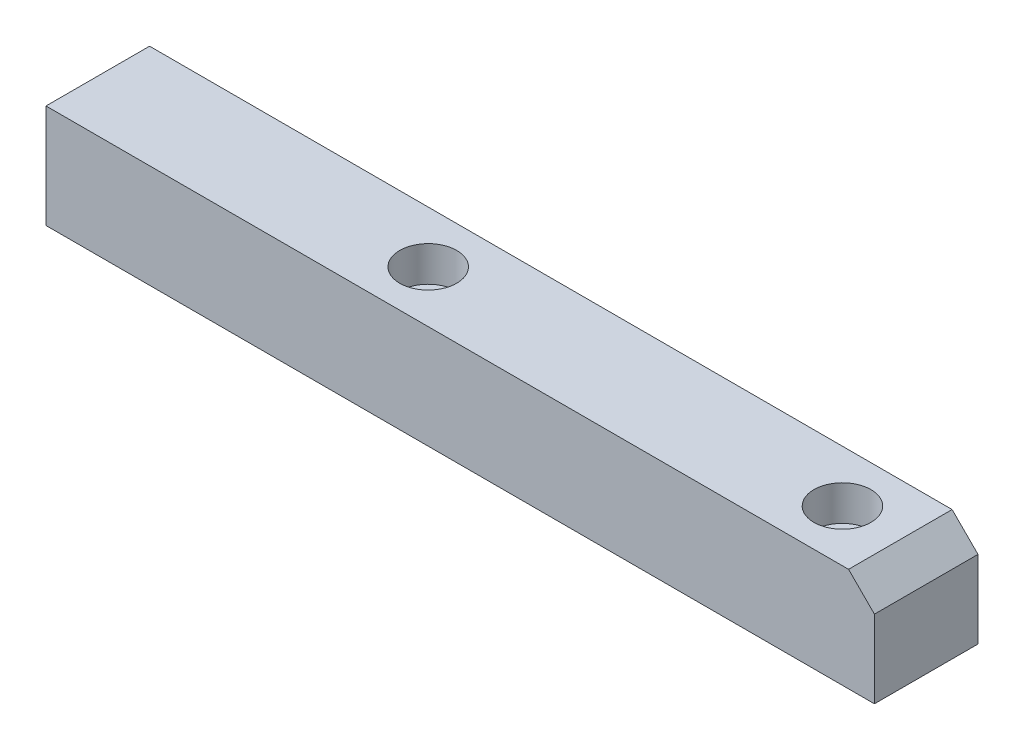
ISO-10303-21;
HEADER;
FILE_DESCRIPTION(('STEP AP214'),'2;1');
FILE_NAME('part.step','',(''),(''),'','','');
FILE_SCHEMA(('AUTOMOTIVE_DESIGN { 1 0 10303 214 1 1 1 1 }'));
ENDSEC;
DATA;
#1=APPLICATION_CONTEXT('core data for automotive mechanical design processes');
#2=APPLICATION_PROTOCOL_DEFINITION('international standard','automotive_design',2000,#1);
#3=PRODUCT_CONTEXT('',#1,'mechanical');
#4=PRODUCT('Part','Part','',(#3));
#5=PRODUCT_RELATED_PRODUCT_CATEGORY('part','',(#4));
#6=PRODUCT_DEFINITION_FORMATION('','',#4);
#7=PRODUCT_DEFINITION_CONTEXT('part definition',#1,'design');
#8=PRODUCT_DEFINITION('design','',#6,#7);
#9=PRODUCT_DEFINITION_SHAPE('','',#8);
#10=(LENGTH_UNIT() NAMED_UNIT(*) SI_UNIT(.MILLI.,.METRE.));
#11=(NAMED_UNIT(*) PLANE_ANGLE_UNIT() SI_UNIT($,.RADIAN.));
#12=(NAMED_UNIT(*) SI_UNIT($,.STERADIAN.) SOLID_ANGLE_UNIT());
#13=UNCERTAINTY_MEASURE_WITH_UNIT(LENGTH_MEASURE(1.E-05),#10,'distance_accuracy_value','');
#14=(GEOMETRIC_REPRESENTATION_CONTEXT(3) GLOBAL_UNCERTAINTY_ASSIGNED_CONTEXT((#13)) GLOBAL_UNIT_ASSIGNED_CONTEXT((#10,
#11,#12)) REPRESENTATION_CONTEXT('',''));
#15=CARTESIAN_POINT('',(0.,0.,0.));
#16=DIRECTION('',(0.,0.,1.));
#17=DIRECTION('',(1.,0.,0.));
#18=AXIS2_PLACEMENT_3D('',#15,#16,#17);
#19=CARTESIAN_POINT('',(-80.,10.,10.));
#20=DIRECTION('',(1.,0.,0.));
#21=DIRECTION('',(0.,0.,-1.));
#22=AXIS2_PLACEMENT_3D('',#19,#20,#21);
#23=PLANE('',#22);
#24=CARTESIAN_POINT('',(-80.,0.,0.));
#25=DIRECTION('',(-1.,0.,0.));
#26=DIRECTION('',(0.,0.,1.));
#27=AXIS2_PLACEMENT_3D('',#24,#25,#26);
#28=CIRCLE('',#27,2.5);
#29=CARTESIAN_POINT('',(-80.,0.,2.5));
#30=VERTEX_POINT('',#29);
#31=EDGE_CURVE('E105',#30,#30,#28,.T.);
#32=ORIENTED_EDGE('',*,*,#31,.F.);
#33=EDGE_LOOP('',(#32));
#34=FACE_BOUND('',#33,.T.);
#35=DIRECTION('',(0.,0.,1.));
#36=VECTOR('',#35,1.);
#37=CARTESIAN_POINT('',(-80.,-10.,10.));
#38=LINE('',#37,#36);
#39=CARTESIAN_POINT('',(-80.,-10.,-9.99999999999999));
#40=VERTEX_POINT('',#39);
#41=CARTESIAN_POINT('',(-80.,-10.,10.));
#42=VERTEX_POINT('',#41);
#43=EDGE_CURVE('E142',#40,#42,#38,.T.);
#44=ORIENTED_EDGE('',*,*,#43,.T.);
#45=DIRECTION('',(0.,-1.,0.));
#46=VECTOR('',#45,1.);
#47=CARTESIAN_POINT('',(-80.,10.,10.));
#48=LINE('',#47,#46);
#49=CARTESIAN_POINT('',(-80.,10.,10.));
#50=VERTEX_POINT('',#49);
#51=EDGE_CURVE('E178',#50,#42,#48,.T.);
#52=ORIENTED_EDGE('',*,*,#51,.F.);
#53=DIRECTION('',(0.,0.,1.));
#54=VECTOR('',#53,1.);
#55=CARTESIAN_POINT('',(-80.,10.,10.));
#56=LINE('',#55,#54);
#57=CARTESIAN_POINT('',(-80.,10.,-9.99999999999999));
#58=VERTEX_POINT('',#57);
#59=EDGE_CURVE('E143',#58,#50,#56,.T.);
#60=ORIENTED_EDGE('',*,*,#59,.F.);
#61=DIRECTION('',(0.,-1.,0.));
#62=VECTOR('',#61,1.);
#63=CARTESIAN_POINT('',(-80.,10.,-9.99999999999999));
#64=LINE('',#63,#62);
#65=EDGE_CURVE('E155',#58,#40,#64,.T.);
#66=ORIENTED_EDGE('',*,*,#65,.T.);
#67=EDGE_LOOP('',(#44,#52,#60,#66));
#68=FACE_BOUND('',#67,.T.);
#69=ADVANCED_FACE('F45',(#34,#68),#23,.F.);
#70=CARTESIAN_POINT('',(80.,10.,9.99999999999999));
#71=DIRECTION('',(0.,0.,-1.));
#72=DIRECTION('',(-1.,0.,0.));
#73=AXIS2_PLACEMENT_3D('',#70,#71,#72);
#74=PLANE('',#73);
#75=DIRECTION('',(0.,-1.,0.));
#76=VECTOR('',#75,1.);
#77=CARTESIAN_POINT('',(80.,10.,9.99999999999999));
#78=LINE('',#77,#76);
#79=CARTESIAN_POINT('',(80.,4.99999999999998,9.99999999999999));
#80=VERTEX_POINT('',#79);
#81=CARTESIAN_POINT('',(80.,-10.,9.99999999999999));
#82=VERTEX_POINT('',#81);
#83=EDGE_CURVE('E175',#80,#82,#78,.T.);
#84=ORIENTED_EDGE('',*,*,#83,.F.);
#85=DIRECTION('',(-0.707106781186547,0.707106781186549,0.));
#86=VECTOR('',#85,1.);
#87=CARTESIAN_POINT('',(75.,10.,9.99999999999999));
#88=LINE('',#87,#86);
#89=CARTESIAN_POINT('',(75.,10.,9.99999999999999));
#90=VERTEX_POINT('',#89);
#91=EDGE_CURVE('E11',#80,#90,#88,.T.);
#92=ORIENTED_EDGE('',*,*,#91,.T.);
#93=DIRECTION('',(1.,0.,0.));
#94=VECTOR('',#93,1.);
#95=CARTESIAN_POINT('',(80.,10.,9.99999999999999));
#96=LINE('',#95,#94);
#97=EDGE_CURVE('E147',#50,#90,#96,.T.);
#98=ORIENTED_EDGE('',*,*,#97,.F.);
#99=ORIENTED_EDGE('',*,*,#51,.T.);
#100=DIRECTION('',(1.,0.,0.));
#101=VECTOR('',#100,1.);
#102=CARTESIAN_POINT('',(80.,-10.,9.99999999999999));
#103=LINE('',#102,#101);
#104=EDGE_CURVE('E159',#42,#82,#103,.T.);
#105=ORIENTED_EDGE('',*,*,#104,.T.);
#106=EDGE_LOOP('',(#84,#92,#98,#99,#105));
#107=FACE_BOUND('',#106,.T.);
#108=ADVANCED_FACE('F201',(#107),#74,.F.);
#109=CARTESIAN_POINT('',(80.,10.,9.99999999999999));
#110=DIRECTION('',(-1.,0.,0.));
#111=DIRECTION('',(0.,0.,1.));
#112=AXIS2_PLACEMENT_3D('',#109,#110,#111);
#113=PLANE('',#112);
#114=DIRECTION('',(0.,-1.,0.));
#115=VECTOR('',#114,1.);
#116=CARTESIAN_POINT('',(80.,10.,-10.));
#117=LINE('',#116,#115);
#118=CARTESIAN_POINT('',(80.,4.99999999999998,-10.));
#119=VERTEX_POINT('',#118);
#120=CARTESIAN_POINT('',(80.,-10.,-10.));
#121=VERTEX_POINT('',#120);
#122=EDGE_CURVE('E172',#119,#121,#117,.T.);
#123=ORIENTED_EDGE('',*,*,#122,.F.);
#124=DIRECTION('',(0.,0.,1.));
#125=VECTOR('',#124,1.);
#126=CARTESIAN_POINT('',(80.,4.99999999999998,9.99999999999999));
#127=LINE('',#126,#125);
#128=EDGE_CURVE('E55',#119,#80,#127,.T.);
#129=ORIENTED_EDGE('',*,*,#128,.T.);
#130=ORIENTED_EDGE('',*,*,#83,.T.);
#131=DIRECTION('',(0.,0.,-1.));
#132=VECTOR('',#131,1.);
#133=CARTESIAN_POINT('',(80.,-10.,9.99999999999999));
#134=LINE('',#133,#132);
#135=EDGE_CURVE('E163',#82,#121,#134,.T.);
#136=ORIENTED_EDGE('',*,*,#135,.T.);
#137=EDGE_LOOP('',(#123,#129,#130,#136));
#138=FACE_BOUND('',#137,.T.);
#139=ADVANCED_FACE('F213',(#138),#113,.F.);
#140=CARTESIAN_POINT('',(80.,10.,-10.));
#141=DIRECTION('',(0.,0.,1.));
#142=DIRECTION('',(1.,0.,0.));
#143=AXIS2_PLACEMENT_3D('',#140,#141,#142);
#144=PLANE('',#143);
#145=DIRECTION('',(-1.,0.,0.));
#146=VECTOR('',#145,1.);
#147=CARTESIAN_POINT('',(80.,10.,-10.));
#148=LINE('',#147,#146);
#149=CARTESIAN_POINT('',(75.,10.,-10.));
#150=VERTEX_POINT('',#149);
#151=EDGE_CURVE('E152',#150,#58,#148,.T.);
#152=ORIENTED_EDGE('',*,*,#151,.F.);
#153=DIRECTION('',(0.707106781186547,-0.707106781186549,0.));
#154=VECTOR('',#153,1.);
#155=CARTESIAN_POINT('',(75.,10.,-10.));
#156=LINE('',#155,#154);
#157=EDGE_CURVE('E69',#150,#119,#156,.T.);
#158=ORIENTED_EDGE('',*,*,#157,.T.);
#159=ORIENTED_EDGE('',*,*,#122,.T.);
#160=DIRECTION('',(-1.,0.,0.));
#161=VECTOR('',#160,1.);
#162=CARTESIAN_POINT('',(80.,-10.,-10.));
#163=LINE('',#162,#161);
#164=EDGE_CURVE('E148',#121,#40,#163,.T.);
#165=ORIENTED_EDGE('',*,*,#164,.T.);
#166=ORIENTED_EDGE('',*,*,#65,.F.);
#167=EDGE_LOOP('',(#152,#158,#159,#165,#166));
#168=FACE_BOUND('',#167,.T.);
#169=ADVANCED_FACE('F194',(#168),#144,.F.);
#170=CARTESIAN_POINT('',(0.,10.,0.));
#171=DIRECTION('',(0.,1.,0.));
#172=DIRECTION('',(0.,0.,1.));
#173=AXIS2_PLACEMENT_3D('',#170,#171,#172);
#174=PLANE('',#173);
#175=CARTESIAN_POINT('',(-16.182,10.,0.));
#176=DIRECTION('',(0.,1.,0.));
#177=DIRECTION('',(0.,0.,1.));
#178=AXIS2_PLACEMENT_3D('',#175,#176,#177);
#179=CIRCLE('',#178,5.5);
#180=CARTESIAN_POINT('',(-16.182,10.,5.5));
#181=VERTEX_POINT('',#180);
#182=EDGE_CURVE('E104',#181,#181,#179,.T.);
#183=ORIENTED_EDGE('',*,*,#182,.F.);
#184=EDGE_LOOP('',(#183));
#185=FACE_BOUND('',#184,.T.);
#186=CARTESIAN_POINT('',(63.818,10.,0.));
#187=DIRECTION('',(0.,1.,0.));
#188=DIRECTION('',(0.,0.,1.));
#189=AXIS2_PLACEMENT_3D('',#186,#187,#188);
#190=CIRCLE('',#189,5.50000000000001);
#191=CARTESIAN_POINT('',(63.818,10.,5.50000000000001));
#192=VERTEX_POINT('',#191);
#193=EDGE_CURVE('E126',#192,#192,#190,.T.);
#194=ORIENTED_EDGE('',*,*,#193,.F.);
#195=EDGE_LOOP('',(#194));
#196=FACE_BOUND('',#195,.T.);
#197=ORIENTED_EDGE('',*,*,#97,.T.);
#198=DIRECTION('',(0.,0.,-1.));
#199=VECTOR('',#198,1.);
#200=CARTESIAN_POINT('',(75.,10.,-10.));
#201=LINE('',#200,#199);
#202=EDGE_CURVE('E182',#90,#150,#201,.T.);
#203=ORIENTED_EDGE('',*,*,#202,.T.);
#204=ORIENTED_EDGE('',*,*,#151,.T.);
#205=ORIENTED_EDGE('',*,*,#59,.T.);
#206=EDGE_LOOP('',(#197,#203,#204,#205));
#207=FACE_BOUND('',#206,.T.);
#208=ADVANCED_FACE('F190',(#185,#196,#207),#174,.T.);
#209=CARTESIAN_POINT('',(0.,-10.,0.));
#210=DIRECTION('',(0.,1.,0.));
#211=DIRECTION('',(0.,0.,1.));
#212=AXIS2_PLACEMENT_3D('',#209,#210,#211);
#213=PLANE('',#212);
#214=CARTESIAN_POINT('',(-16.182,-10.,0.));
#215=DIRECTION('',(0.,1.,0.));
#216=DIRECTION('',(0.,0.,1.));
#217=AXIS2_PLACEMENT_3D('',#214,#215,#216);
#218=CIRCLE('',#217,3.29999999999999);
#219=CARTESIAN_POINT('',(-16.182,-10.,3.29999999999999));
#220=VERTEX_POINT('',#219);
#221=EDGE_CURVE('E122',#220,#220,#218,.T.);
#222=ORIENTED_EDGE('',*,*,#221,.T.);
#223=EDGE_LOOP('',(#222));
#224=FACE_BOUND('',#223,.T.);
#225=CARTESIAN_POINT('',(63.818,-10.,0.));
#226=DIRECTION('',(0.,1.,0.));
#227=DIRECTION('',(0.,0.,1.));
#228=AXIS2_PLACEMENT_3D('',#225,#226,#227);
#229=CIRCLE('',#228,3.3);
#230=CARTESIAN_POINT('',(63.818,-10.,3.3));
#231=VERTEX_POINT('',#230);
#232=EDGE_CURVE('E138',#231,#231,#229,.T.);
#233=ORIENTED_EDGE('',*,*,#232,.T.);
#234=EDGE_LOOP('',(#233));
#235=FACE_BOUND('',#234,.T.);
#236=ORIENTED_EDGE('',*,*,#43,.F.);
#237=ORIENTED_EDGE('',*,*,#164,.F.);
#238=ORIENTED_EDGE('',*,*,#135,.F.);
#239=ORIENTED_EDGE('',*,*,#104,.F.);
#240=EDGE_LOOP('',(#236,#237,#238,#239));
#241=FACE_BOUND('',#240,.T.);
#242=ADVANCED_FACE('F221',(#224,#235,#241),#213,.F.);
#243=CARTESIAN_POINT('',(63.818,10.,0.));
#244=DIRECTION('',(0.,1.,0.));
#245=DIRECTION('',(0.,0.,1.));
#246=AXIS2_PLACEMENT_3D('',#243,#244,#245);
#247=CYLINDRICAL_SURFACE('',#246,3.3);
#248=ORIENTED_EDGE('',*,*,#232,.F.);
#249=EDGE_LOOP('',(#248));
#250=FACE_BOUND('',#249,.T.);
#251=CARTESIAN_POINT('',(63.818,3.2,0.));
#252=DIRECTION('',(0.,1.,0.));
#253=DIRECTION('',(0.,0.,1.));
#254=AXIS2_PLACEMENT_3D('',#251,#252,#253);
#255=CIRCLE('',#254,3.3);
#256=CARTESIAN_POINT('',(63.818,3.2,3.3));
#257=VERTEX_POINT('',#256);
#258=EDGE_CURVE('E134',#257,#257,#255,.T.);
#259=ORIENTED_EDGE('',*,*,#258,.T.);
#260=EDGE_LOOP('',(#259));
#261=FACE_BOUND('',#260,.T.);
#262=ADVANCED_FACE('F224',(#250,#261),#247,.F.);
#263=CARTESIAN_POINT('',(67.118,3.2,0.));
#264=DIRECTION('',(0.,-1.,0.));
#265=DIRECTION('',(0.,0.,-1.));
#266=AXIS2_PLACEMENT_3D('',#263,#264,#265);
#267=PLANE('',#266);
#268=ORIENTED_EDGE('',*,*,#258,.F.);
#269=EDGE_LOOP('',(#268));
#270=FACE_BOUND('',#269,.T.);
#271=CARTESIAN_POINT('',(63.818,3.2,0.));
#272=DIRECTION('',(0.,1.,0.));
#273=DIRECTION('',(0.,0.,1.));
#274=AXIS2_PLACEMENT_3D('',#271,#272,#273);
#275=CIRCLE('',#274,5.50000000000001);
#276=CARTESIAN_POINT('',(63.818,3.2,5.50000000000001));
#277=VERTEX_POINT('',#276);
#278=EDGE_CURVE('E130',#277,#277,#275,.T.);
#279=ORIENTED_EDGE('',*,*,#278,.T.);
#280=EDGE_LOOP('',(#279));
#281=FACE_BOUND('',#280,.T.);
#282=ADVANCED_FACE('F231',(#270,#281),#267,.F.);
#283=CARTESIAN_POINT('',(63.818,10.,0.));
#284=DIRECTION('',(0.,1.,0.));
#285=DIRECTION('',(0.,0.,1.));
#286=AXIS2_PLACEMENT_3D('',#283,#284,#285);
#287=CYLINDRICAL_SURFACE('',#286,5.50000000000001);
#288=ORIENTED_EDGE('',*,*,#278,.F.);
#289=EDGE_LOOP('',(#288));
#290=FACE_BOUND('',#289,.T.);
#291=ORIENTED_EDGE('',*,*,#193,.T.);
#292=EDGE_LOOP('',(#291));
#293=FACE_BOUND('',#292,.T.);
#294=ADVANCED_FACE('F235',(#290,#293),#287,.F.);
#295=CARTESIAN_POINT('',(-16.182,10.,0.));
#296=DIRECTION('',(0.,1.,0.));
#297=DIRECTION('',(0.,0.,1.));
#298=AXIS2_PLACEMENT_3D('',#295,#296,#297);
#299=CYLINDRICAL_SURFACE('',#298,3.3);
#300=ORIENTED_EDGE('',*,*,#221,.F.);
#301=EDGE_LOOP('',(#300));
#302=FACE_BOUND('',#301,.T.);
#303=CARTESIAN_POINT('',(-16.182,3.2,0.));
#304=DIRECTION('',(0.,1.,0.));
#305=DIRECTION('',(0.,0.,1.));
#306=AXIS2_PLACEMENT_3D('',#303,#304,#305);
#307=CIRCLE('',#306,3.3);
#308=CARTESIAN_POINT('',(-16.182,3.2,3.3));
#309=VERTEX_POINT('',#308);
#310=EDGE_CURVE('E118',#309,#309,#307,.T.);
#311=ORIENTED_EDGE('',*,*,#310,.T.);
#312=EDGE_LOOP('',(#311));
#313=FACE_BOUND('',#312,.T.);
#314=ADVANCED_FACE('F239',(#302,#313),#299,.F.);
#315=CARTESIAN_POINT('',(-12.882,3.2,0.));
#316=DIRECTION('',(0.,-1.,0.));
#317=DIRECTION('',(0.,0.,-1.));
#318=AXIS2_PLACEMENT_3D('',#315,#316,#317);
#319=PLANE('',#318);
#320=ORIENTED_EDGE('',*,*,#310,.F.);
#321=EDGE_LOOP('',(#320));
#322=FACE_BOUND('',#321,.T.);
#323=CARTESIAN_POINT('',(-16.182,3.2,0.));
#324=DIRECTION('',(0.,1.,0.));
#325=DIRECTION('',(0.,0.,1.));
#326=AXIS2_PLACEMENT_3D('',#323,#324,#325);
#327=CIRCLE('',#326,5.5);
#328=CARTESIAN_POINT('',(-16.182,3.2,5.5));
#329=VERTEX_POINT('',#328);
#330=EDGE_CURVE('E110',#329,#329,#327,.T.);
#331=ORIENTED_EDGE('',*,*,#330,.T.);
#332=EDGE_LOOP('',(#331));
#333=FACE_BOUND('',#332,.T.);
#334=ADVANCED_FACE('F243',(#322,#333),#319,.F.);
#335=CARTESIAN_POINT('',(-16.182,10.,0.));
#336=DIRECTION('',(0.,1.,0.));
#337=DIRECTION('',(0.,0.,1.));
#338=AXIS2_PLACEMENT_3D('',#335,#336,#337);
#339=CYLINDRICAL_SURFACE('',#338,5.5);
#340=ORIENTED_EDGE('',*,*,#330,.F.);
#341=EDGE_LOOP('',(#340));
#342=FACE_BOUND('',#341,.T.);
#343=ORIENTED_EDGE('',*,*,#182,.T.);
#344=EDGE_LOOP('',(#343));
#345=FACE_BOUND('',#344,.T.);
#346=ADVANCED_FACE('F97',(#342,#345),#339,.F.);
#347=CARTESIAN_POINT('',(-65.,0.,0.));
#348=DIRECTION('',(-1.,0.,0.));
#349=DIRECTION('',(0.,0.,1.));
#350=AXIS2_PLACEMENT_3D('',#347,#348,#349);
#351=CONICAL_SURFACE('',#350,2.5,1.02974425867665);
#352=CARTESIAN_POINT('',(-63.4978484524311,0.,0.));
#353=VERTEX_POINT('',#352);
#354=VERTEX_LOOP('',#353);
#355=FACE_BOUND('',#354,.T.);
#356=CARTESIAN_POINT('',(-65.,0.,0.));
#357=DIRECTION('',(-1.,0.,0.));
#358=DIRECTION('',(0.,0.,1.));
#359=AXIS2_PLACEMENT_3D('',#356,#357,#358);
#360=CIRCLE('',#359,2.5);
#361=CARTESIAN_POINT('',(-65.,0.,2.5));
#362=VERTEX_POINT('',#361);
#363=EDGE_CURVE('E101',#362,#362,#360,.T.);
#364=ORIENTED_EDGE('',*,*,#363,.T.);
#365=EDGE_LOOP('',(#364));
#366=FACE_BOUND('',#365,.T.);
#367=ADVANCED_FACE('F93',(#355,#366),#351,.F.);
#368=CARTESIAN_POINT('',(-80.,0.,0.));
#369=DIRECTION('',(-1.,0.,0.));
#370=DIRECTION('',(0.,0.,1.));
#371=AXIS2_PLACEMENT_3D('',#368,#369,#370);
#372=CYLINDRICAL_SURFACE('',#371,2.5);
#373=ORIENTED_EDGE('',*,*,#363,.F.);
#374=EDGE_LOOP('',(#373));
#375=FACE_BOUND('',#374,.T.);
#376=ORIENTED_EDGE('',*,*,#31,.T.);
#377=EDGE_LOOP('',(#376));
#378=FACE_BOUND('',#377,.T.);
#379=ADVANCED_FACE('F96',(#375,#378),#372,.F.);
#380=CARTESIAN_POINT('',(75.,10.,0.));
#381=DIRECTION('',(0.707106781186549,0.707106781186547,0.));
#382=DIRECTION('',(0.,0.,1.));
#383=AXIS2_PLACEMENT_3D('',#380,#381,#382);
#384=PLANE('',#383);
#385=ORIENTED_EDGE('',*,*,#91,.F.);
#386=ORIENTED_EDGE('',*,*,#128,.F.);
#387=ORIENTED_EDGE('',*,*,#157,.F.);
#388=ORIENTED_EDGE('',*,*,#202,.F.);
#389=EDGE_LOOP('',(#385,#386,#387,#388));
#390=FACE_BOUND('',#389,.T.);
#391=ADVANCED_FACE('F48',(#390),#384,.T.);
#392=CLOSED_SHELL('',(#69,#108,#139,#169,#208,#242,#262,#282,#294,#314,#334,#346,#367,#379,#391));
#393=MANIFOLD_SOLID_BREP('B2',#392);
#394=ADVANCED_BREP_SHAPE_REPRESENTATION('',(#18,#393),#14);
#395=SHAPE_DEFINITION_REPRESENTATION(#9,#394);
ENDSEC;
END-ISO-10303-21;
